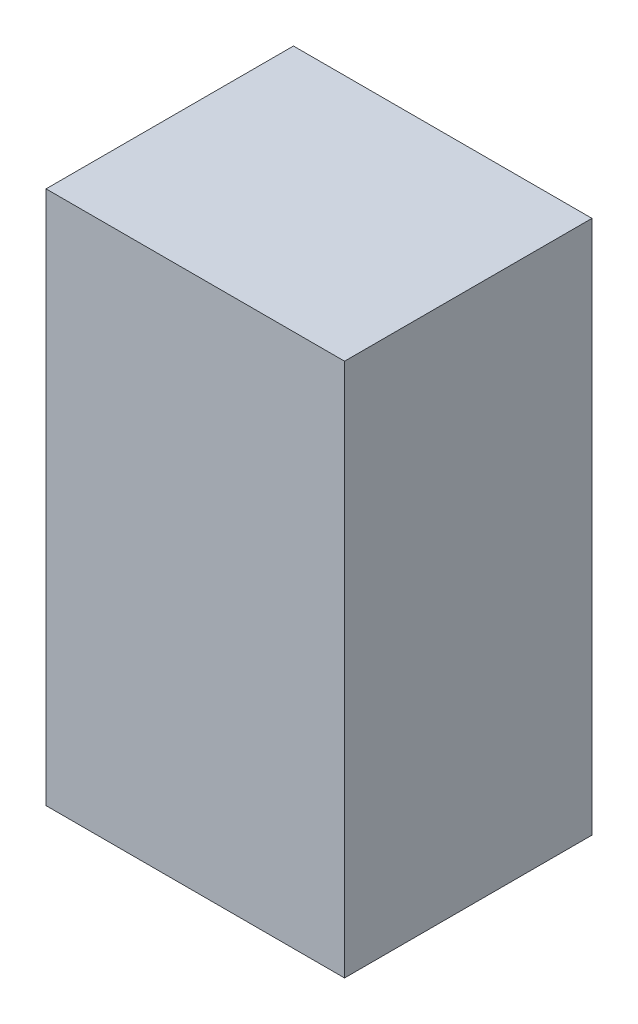
ISO-10303-21;
HEADER;
FILE_DESCRIPTION(('STEP AP214'),'2;1');
FILE_NAME('part.step','',(''),(''),'','','');
FILE_SCHEMA(('AUTOMOTIVE_DESIGN { 1 0 10303 214 1 1 1 1 }'));
ENDSEC;
DATA;
#1=APPLICATION_CONTEXT('core data for automotive mechanical design processes');
#2=APPLICATION_PROTOCOL_DEFINITION('international standard','automotive_design',2000,#1);
#3=PRODUCT_CONTEXT('',#1,'mechanical');
#4=PRODUCT('Part','Part','',(#3));
#5=PRODUCT_RELATED_PRODUCT_CATEGORY('part','',(#4));
#6=PRODUCT_DEFINITION_FORMATION('','',#4);
#7=PRODUCT_DEFINITION_CONTEXT('part definition',#1,'design');
#8=PRODUCT_DEFINITION('design','',#6,#7);
#9=PRODUCT_DEFINITION_SHAPE('','',#8);
#10=(LENGTH_UNIT() NAMED_UNIT(*) SI_UNIT(.MILLI.,.METRE.));
#11=(NAMED_UNIT(*) PLANE_ANGLE_UNIT() SI_UNIT($,.RADIAN.));
#12=(NAMED_UNIT(*) SI_UNIT($,.STERADIAN.) SOLID_ANGLE_UNIT());
#13=UNCERTAINTY_MEASURE_WITH_UNIT(LENGTH_MEASURE(1.E-05),#10,'distance_accuracy_value','');
#14=(GEOMETRIC_REPRESENTATION_CONTEXT(3) GLOBAL_UNCERTAINTY_ASSIGNED_CONTEXT((#13)) GLOBAL_UNIT_ASSIGNED_CONTEXT((#10,
#11,#12)) REPRESENTATION_CONTEXT('',''));
#15=CARTESIAN_POINT('',(0.,0.,0.));
#16=DIRECTION('',(0.,0.,1.));
#17=DIRECTION('',(1.,0.,0.));
#18=AXIS2_PLACEMENT_3D('',#15,#16,#17);
#19=CARTESIAN_POINT('',(-2.413,-4.318,4.));
#20=DIRECTION('',(0.,0.,-1.));
#21=DIRECTION('',(-1.,0.,0.));
#22=AXIS2_PLACEMENT_3D('',#19,#20,#21);
#23=PLANE('',#22);
#24=DIRECTION('',(0.,1.,0.));
#25=VECTOR('',#24,1.);
#26=CARTESIAN_POINT('',(2.413,-4.318,4.));
#27=LINE('',#26,#25);
#28=CARTESIAN_POINT('',(2.413,-4.318,4.));
#29=VERTEX_POINT('',#28);
#30=CARTESIAN_POINT('',(2.413,4.318,4.));
#31=VERTEX_POINT('',#30);
#32=EDGE_CURVE('E55',#29,#31,#27,.T.);
#33=ORIENTED_EDGE('',*,*,#32,.T.);
#34=DIRECTION('',(1.,0.,0.));
#35=VECTOR('',#34,1.);
#36=CARTESIAN_POINT('',(2.413,4.318,4.));
#37=LINE('',#36,#35);
#38=CARTESIAN_POINT('',(-2.413,4.318,4.));
#39=VERTEX_POINT('',#38);
#40=EDGE_CURVE('E57',#31,#39,#37,.F.);
#41=ORIENTED_EDGE('',*,*,#40,.T.);
#42=DIRECTION('',(0.,1.,0.));
#43=VECTOR('',#42,1.);
#44=CARTESIAN_POINT('',(-2.413,4.318,4.));
#45=LINE('',#44,#43);
#46=CARTESIAN_POINT('',(-2.413,-4.318,4.));
#47=VERTEX_POINT('',#46);
#48=EDGE_CURVE('E20',#39,#47,#45,.F.);
#49=ORIENTED_EDGE('',*,*,#48,.T.);
#50=DIRECTION('',(1.,0.,0.));
#51=VECTOR('',#50,1.);
#52=CARTESIAN_POINT('',(-2.413,-4.318,4.));
#53=LINE('',#52,#51);
#54=EDGE_CURVE('E80',#47,#29,#53,.T.);
#55=ORIENTED_EDGE('',*,*,#54,.T.);
#56=EDGE_LOOP('',(#33,#41,#49,#55));
#57=FACE_BOUND('',#56,.T.);
#58=ADVANCED_FACE('F17',(#57),#23,.F.);
#59=CARTESIAN_POINT('',(-2.413,4.318,0.));
#60=DIRECTION('',(1.,0.,0.));
#61=DIRECTION('',(0.,0.,-1.));
#62=AXIS2_PLACEMENT_3D('',#59,#60,#61);
#63=PLANE('',#62);
#64=DIRECTION('',(0.,0.,1.));
#65=VECTOR('',#64,1.);
#66=CARTESIAN_POINT('',(-2.413,-4.318,0.));
#67=LINE('',#66,#65);
#68=CARTESIAN_POINT('',(-2.413,-4.318,0.));
#69=VERTEX_POINT('',#68);
#70=EDGE_CURVE('E68',#69,#47,#67,.T.);
#71=ORIENTED_EDGE('',*,*,#70,.T.);
#72=ORIENTED_EDGE('',*,*,#48,.F.);
#73=DIRECTION('',(0.,0.,-1.));
#74=VECTOR('',#73,1.);
#75=CARTESIAN_POINT('',(-2.413,4.318,0.));
#76=LINE('',#75,#74);
#77=CARTESIAN_POINT('',(-2.413,4.318,0.));
#78=VERTEX_POINT('',#77);
#79=EDGE_CURVE('E63',#39,#78,#76,.T.);
#80=ORIENTED_EDGE('',*,*,#79,.T.);
#81=DIRECTION('',(0.,1.,0.));
#82=VECTOR('',#81,1.);
#83=CARTESIAN_POINT('',(-2.413,-4.318,0.));
#84=LINE('',#83,#82);
#85=EDGE_CURVE('E83',#69,#78,#84,.T.);
#86=ORIENTED_EDGE('',*,*,#85,.F.);
#87=EDGE_LOOP('',(#71,#72,#80,#86));
#88=FACE_BOUND('',#87,.T.);
#89=ADVANCED_FACE('F65',(#88),#63,.F.);
#90=CARTESIAN_POINT('',(2.413,4.318,0.));
#91=DIRECTION('',(0.,-1.,0.));
#92=DIRECTION('',(0.,0.,-1.));
#93=AXIS2_PLACEMENT_3D('',#90,#91,#92);
#94=PLANE('',#93);
#95=ORIENTED_EDGE('',*,*,#79,.F.);
#96=ORIENTED_EDGE('',*,*,#40,.F.);
#97=DIRECTION('',(0.,0.,1.));
#98=VECTOR('',#97,1.);
#99=CARTESIAN_POINT('',(2.413,4.318,0.));
#100=LINE('',#99,#98);
#101=CARTESIAN_POINT('',(2.413,4.318,0.));
#102=VERTEX_POINT('',#101);
#103=EDGE_CURVE('E75',#31,#102,#100,.F.);
#104=ORIENTED_EDGE('',*,*,#103,.T.);
#105=DIRECTION('',(-1.,0.,0.));
#106=VECTOR('',#105,1.);
#107=CARTESIAN_POINT('',(-2.413,4.318,0.));
#108=LINE('',#107,#106);
#109=EDGE_CURVE('E72',#78,#102,#108,.F.);
#110=ORIENTED_EDGE('',*,*,#109,.F.);
#111=EDGE_LOOP('',(#95,#96,#104,#110));
#112=FACE_BOUND('',#111,.T.);
#113=ADVANCED_FACE('F70',(#112),#94,.F.);
#114=CARTESIAN_POINT('',(2.413,-4.318,0.));
#115=DIRECTION('',(-1.,0.,0.));
#116=DIRECTION('',(0.,0.,1.));
#117=AXIS2_PLACEMENT_3D('',#114,#115,#116);
#118=PLANE('',#117);
#119=ORIENTED_EDGE('',*,*,#103,.F.);
#120=ORIENTED_EDGE('',*,*,#32,.F.);
#121=DIRECTION('',(0.,0.,1.));
#122=VECTOR('',#121,1.);
#123=CARTESIAN_POINT('',(2.413,-4.318,0.));
#124=LINE('',#123,#122);
#125=CARTESIAN_POINT('',(2.413,-4.318,0.));
#126=VERTEX_POINT('',#125);
#127=EDGE_CURVE('E35',#29,#126,#124,.F.);
#128=ORIENTED_EDGE('',*,*,#127,.T.);
#129=DIRECTION('',(0.,1.,0.));
#130=VECTOR('',#129,1.);
#131=CARTESIAN_POINT('',(2.413,-4.318,0.));
#132=LINE('',#131,#130);
#133=EDGE_CURVE('E26',#102,#126,#132,.F.);
#134=ORIENTED_EDGE('',*,*,#133,.F.);
#135=EDGE_LOOP('',(#119,#120,#128,#134));
#136=FACE_BOUND('',#135,.T.);
#137=ADVANCED_FACE('F89',(#136),#118,.F.);
#138=CARTESIAN_POINT('',(-2.413,-4.318,0.));
#139=DIRECTION('',(0.,1.,0.));
#140=DIRECTION('',(0.,0.,1.));
#141=AXIS2_PLACEMENT_3D('',#138,#139,#140);
#142=PLANE('',#141);
#143=ORIENTED_EDGE('',*,*,#127,.F.);
#144=ORIENTED_EDGE('',*,*,#54,.F.);
#145=ORIENTED_EDGE('',*,*,#70,.F.);
#146=DIRECTION('',(-1.,0.,0.));
#147=VECTOR('',#146,1.);
#148=CARTESIAN_POINT('',(-2.413,-4.318,0.));
#149=LINE('',#148,#147);
#150=EDGE_CURVE('E11',#126,#69,#149,.T.);
#151=ORIENTED_EDGE('',*,*,#150,.F.);
#152=EDGE_LOOP('',(#143,#144,#145,#151));
#153=FACE_BOUND('',#152,.T.);
#154=ADVANCED_FACE('F91',(#153),#142,.F.);
#155=CARTESIAN_POINT('',(-2.413,-4.318,0.));
#156=DIRECTION('',(0.,0.,-1.));
#157=DIRECTION('',(-1.,0.,0.));
#158=AXIS2_PLACEMENT_3D('',#155,#156,#157);
#159=PLANE('',#158);
#160=ORIENTED_EDGE('',*,*,#133,.T.);
#161=ORIENTED_EDGE('',*,*,#150,.T.);
#162=ORIENTED_EDGE('',*,*,#85,.T.);
#163=ORIENTED_EDGE('',*,*,#109,.T.);
#164=EDGE_LOOP('',(#160,#161,#162,#163));
#165=FACE_BOUND('',#164,.T.);
#166=ADVANCED_FACE('F88',(#165),#159,.T.);
#167=CLOSED_SHELL('',(#58,#89,#113,#137,#154,#166));
#168=MANIFOLD_SOLID_BREP('B1',#167);
#169=ADVANCED_BREP_SHAPE_REPRESENTATION('',(#18,#168),#14);
#170=SHAPE_DEFINITION_REPRESENTATION(#9,#169);
ENDSEC;
END-ISO-10303-21;
